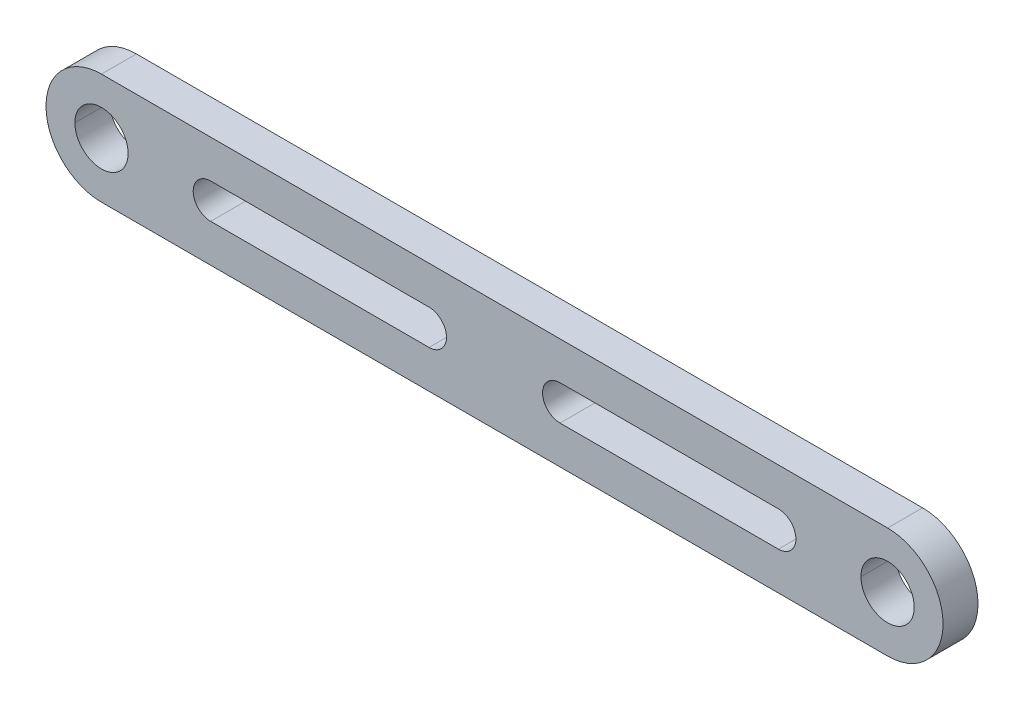
ISO-10303-21;
HEADER;
FILE_DESCRIPTION(('STEP AP214'),'2;1');
FILE_NAME('part.step','',(''),(''),'','','');
FILE_SCHEMA(('AUTOMOTIVE_DESIGN { 1 0 10303 214 1 1 1 1 }'));
ENDSEC;
DATA;
#1=APPLICATION_CONTEXT('core data for automotive mechanical design processes');
#2=APPLICATION_PROTOCOL_DEFINITION('international standard','automotive_design',2000,#1);
#3=PRODUCT_CONTEXT('',#1,'mechanical');
#4=PRODUCT('Part','Part','',(#3));
#5=PRODUCT_RELATED_PRODUCT_CATEGORY('part','',(#4));
#6=PRODUCT_DEFINITION_FORMATION('','',#4);
#7=PRODUCT_DEFINITION_CONTEXT('part definition',#1,'design');
#8=PRODUCT_DEFINITION('design','',#6,#7);
#9=PRODUCT_DEFINITION_SHAPE('','',#8);
#10=(LENGTH_UNIT() NAMED_UNIT(*) SI_UNIT(.MILLI.,.METRE.));
#11=(NAMED_UNIT(*) PLANE_ANGLE_UNIT() SI_UNIT($,.RADIAN.));
#12=(NAMED_UNIT(*) SI_UNIT($,.STERADIAN.) SOLID_ANGLE_UNIT());
#13=UNCERTAINTY_MEASURE_WITH_UNIT(LENGTH_MEASURE(1.E-05),#10,'distance_accuracy_value','');
#14=(GEOMETRIC_REPRESENTATION_CONTEXT(3) GLOBAL_UNCERTAINTY_ASSIGNED_CONTEXT((#13)) GLOBAL_UNIT_ASSIGNED_CONTEXT((#10,
#11,#12)) REPRESENTATION_CONTEXT('',''));
#15=CARTESIAN_POINT('',(0.,0.,0.));
#16=DIRECTION('',(0.,0.,1.));
#17=DIRECTION('',(1.,0.,0.));
#18=AXIS2_PLACEMENT_3D('',#15,#16,#17);
#19=CARTESIAN_POINT('',(-7.5,0.,-2.));
#20=DIRECTION('',(0.,0.,1.));
#21=DIRECTION('',(1.,0.,0.));
#22=AXIS2_PLACEMENT_3D('',#19,#20,#21);
#23=CYLINDRICAL_SURFACE('',#22,2.);
#24=CARTESIAN_POINT('',(-7.5,0.,-2.));
#25=DIRECTION('',(0.,0.,1.));
#26=DIRECTION('',(1.,0.,0.));
#27=AXIS2_PLACEMENT_3D('',#24,#25,#26);
#28=CIRCLE('',#27,2.);
#29=CARTESIAN_POINT('',(-5.5,0.,-2.));
#30=VERTEX_POINT('',#29);
#31=CARTESIAN_POINT('',(-7.5,2.,-2.));
#32=VERTEX_POINT('',#31);
#33=EDGE_CURVE('E42',#30,#32,#28,.T.);
#34=ORIENTED_EDGE('',*,*,#33,.F.);
#35=DIRECTION('',(0.,0.,1.));
#36=VECTOR('',#35,1.);
#37=CARTESIAN_POINT('',(-5.5,0.,-2.));
#38=LINE('',#37,#36);
#39=CARTESIAN_POINT('',(-5.5,0.,2.));
#40=VERTEX_POINT('',#39);
#41=EDGE_CURVE('E11',#30,#40,#38,.T.);
#42=ORIENTED_EDGE('',*,*,#41,.T.);
#43=CARTESIAN_POINT('',(-7.5,0.,2.));
#44=DIRECTION('',(0.,0.,1.));
#45=DIRECTION('',(1.,0.,0.));
#46=AXIS2_PLACEMENT_3D('',#43,#44,#45);
#47=CIRCLE('',#46,2.);
#48=CARTESIAN_POINT('',(-7.5,2.,2.));
#49=VERTEX_POINT('',#48);
#50=EDGE_CURVE('E28',#40,#49,#47,.T.);
#51=ORIENTED_EDGE('',*,*,#50,.T.);
#52=DIRECTION('',(0.,0.,1.));
#53=VECTOR('',#52,1.);
#54=CARTESIAN_POINT('',(-7.5,2.,-2.));
#55=LINE('',#54,#53);
#56=EDGE_CURVE('E286',#32,#49,#55,.T.);
#57=ORIENTED_EDGE('',*,*,#56,.F.);
#58=EDGE_LOOP('',(#34,#42,#51,#57));
#59=FACE_BOUND('',#58,.T.);
#60=ADVANCED_FACE('F17',(#59),#23,.F.);
#61=CARTESIAN_POINT('',(32.5,0.,-2.));
#62=DIRECTION('',(0.,0.,1.));
#63=DIRECTION('',(1.,0.,0.));
#64=AXIS2_PLACEMENT_3D('',#61,#62,#63);
#65=CYLINDRICAL_SURFACE('',#64,2.);
#66=CARTESIAN_POINT('',(32.5,0.,-2.));
#67=DIRECTION('',(0.,0.,1.));
#68=DIRECTION('',(1.,0.,0.));
#69=AXIS2_PLACEMENT_3D('',#66,#67,#68);
#70=CIRCLE('',#69,2.);
#71=CARTESIAN_POINT('',(34.5,0.,-2.));
#72=VERTEX_POINT('',#71);
#73=CARTESIAN_POINT('',(32.5,2.,-2.));
#74=VERTEX_POINT('',#73);
#75=EDGE_CURVE('E179',#72,#74,#70,.T.);
#76=ORIENTED_EDGE('',*,*,#75,.F.);
#77=DIRECTION('',(0.,0.,1.));
#78=VECTOR('',#77,1.);
#79=CARTESIAN_POINT('',(34.5,0.,-2.));
#80=LINE('',#79,#78);
#81=CARTESIAN_POINT('',(34.5,0.,2.));
#82=VERTEX_POINT('',#81);
#83=EDGE_CURVE('E265',#72,#82,#80,.T.);
#84=ORIENTED_EDGE('',*,*,#83,.T.);
#85=CARTESIAN_POINT('',(32.5,0.,2.));
#86=DIRECTION('',(0.,0.,1.));
#87=DIRECTION('',(1.,0.,0.));
#88=AXIS2_PLACEMENT_3D('',#85,#86,#87);
#89=CIRCLE('',#88,2.);
#90=CARTESIAN_POINT('',(32.5,2.,2.));
#91=VERTEX_POINT('',#90);
#92=EDGE_CURVE('E181',#82,#91,#89,.T.);
#93=ORIENTED_EDGE('',*,*,#92,.T.);
#94=DIRECTION('',(0.,0.,1.));
#95=VECTOR('',#94,1.);
#96=CARTESIAN_POINT('',(32.5,2.,-2.));
#97=LINE('',#96,#95);
#98=EDGE_CURVE('E165',#74,#91,#97,.T.);
#99=ORIENTED_EDGE('',*,*,#98,.F.);
#100=EDGE_LOOP('',(#76,#84,#93,#99));
#101=FACE_BOUND('',#100,.T.);
#102=ADVANCED_FACE('F177',(#101),#65,.F.);
#103=CARTESIAN_POINT('',(45.,0.,2.));
#104=DIRECTION('',(0.,0.,-1.));
#105=DIRECTION('',(-1.,0.,0.));
#106=AXIS2_PLACEMENT_3D('',#103,#104,#105);
#107=CYLINDRICAL_SURFACE('',#106,3.05);
#108=CARTESIAN_POINT('',(45.,0.,2.));
#109=DIRECTION('',(0.,0.,1.));
#110=DIRECTION('',(1.,0.,0.));
#111=AXIS2_PLACEMENT_3D('',#108,#109,#110);
#112=CIRCLE('',#111,3.05);
#113=CARTESIAN_POINT('',(41.95,0.,2.));
#114=VERTEX_POINT('',#113);
#115=CARTESIAN_POINT('',(48.05,0.,2.));
#116=VERTEX_POINT('',#115);
#117=EDGE_CURVE('E223',#114,#116,#112,.T.);
#118=ORIENTED_EDGE('',*,*,#117,.T.);
#119=DIRECTION('',(0.,0.,-1.));
#120=VECTOR('',#119,1.);
#121=CARTESIAN_POINT('',(48.05,0.,2.));
#122=LINE('',#121,#120);
#123=CARTESIAN_POINT('',(48.05,0.,-2.));
#124=VERTEX_POINT('',#123);
#125=EDGE_CURVE('E227',#116,#124,#122,.T.);
#126=ORIENTED_EDGE('',*,*,#125,.T.);
#127=CARTESIAN_POINT('',(45.,0.,-2.));
#128=DIRECTION('',(0.,0.,1.));
#129=DIRECTION('',(1.,0.,0.));
#130=AXIS2_PLACEMENT_3D('',#127,#128,#129);
#131=CIRCLE('',#130,3.05);
#132=CARTESIAN_POINT('',(41.95,0.,-2.));
#133=VERTEX_POINT('',#132);
#134=EDGE_CURVE('E255',#133,#124,#131,.T.);
#135=ORIENTED_EDGE('',*,*,#134,.F.);
#136=DIRECTION('',(0.,0.,-1.));
#137=VECTOR('',#136,1.);
#138=CARTESIAN_POINT('',(41.95,0.,2.));
#139=LINE('',#138,#137);
#140=EDGE_CURVE('E245',#114,#133,#139,.T.);
#141=ORIENTED_EDGE('',*,*,#140,.F.);
#142=EDGE_LOOP('',(#118,#126,#135,#141));
#143=FACE_BOUND('',#142,.T.);
#144=ADVANCED_FACE('F644',(#143),#107,.F.);
#145=CARTESIAN_POINT('',(-45.,0.,2.));
#146=DIRECTION('',(0.,0.,-1.));
#147=DIRECTION('',(-1.,0.,0.));
#148=AXIS2_PLACEMENT_3D('',#145,#146,#147);
#149=CYLINDRICAL_SURFACE('',#148,3.05);
#150=CARTESIAN_POINT('',(-45.,0.,2.));
#151=DIRECTION('',(0.,0.,1.));
#152=DIRECTION('',(1.,0.,0.));
#153=AXIS2_PLACEMENT_3D('',#150,#151,#152);
#154=CIRCLE('',#153,3.05);
#155=CARTESIAN_POINT('',(-48.05,0.,2.));
#156=VERTEX_POINT('',#155);
#157=CARTESIAN_POINT('',(-41.95,0.,2.));
#158=VERTEX_POINT('',#157);
#159=EDGE_CURVE('E348',#156,#158,#154,.T.);
#160=ORIENTED_EDGE('',*,*,#159,.T.);
#161=DIRECTION('',(0.,0.,-1.));
#162=VECTOR('',#161,1.);
#163=CARTESIAN_POINT('',(-41.95,0.,2.));
#164=LINE('',#163,#162);
#165=CARTESIAN_POINT('',(-41.95,0.,-2.));
#166=VERTEX_POINT('',#165);
#167=EDGE_CURVE('E232',#158,#166,#164,.T.);
#168=ORIENTED_EDGE('',*,*,#167,.T.);
#169=CARTESIAN_POINT('',(-45.,0.,-2.));
#170=DIRECTION('',(0.,0.,1.));
#171=DIRECTION('',(1.,0.,0.));
#172=AXIS2_PLACEMENT_3D('',#169,#170,#171);
#173=CIRCLE('',#172,3.05);
#174=CARTESIAN_POINT('',(-48.05,0.,-2.));
#175=VERTEX_POINT('',#174);
#176=EDGE_CURVE('E196',#175,#166,#173,.T.);
#177=ORIENTED_EDGE('',*,*,#176,.F.);
#178=DIRECTION('',(0.,0.,-1.));
#179=VECTOR('',#178,1.);
#180=CARTESIAN_POINT('',(-48.05,0.,2.));
#181=LINE('',#180,#179);
#182=EDGE_CURVE('E244',#156,#175,#181,.T.);
#183=ORIENTED_EDGE('',*,*,#182,.F.);
#184=EDGE_LOOP('',(#160,#168,#177,#183));
#185=FACE_BOUND('',#184,.T.);
#186=ADVANCED_FACE('F586',(#185),#149,.F.);
#187=CARTESIAN_POINT('',(-45.,0.,2.));
#188=DIRECTION('',(0.,0.,-1.));
#189=DIRECTION('',(-1.,0.,0.));
#190=AXIS2_PLACEMENT_3D('',#187,#188,#189);
#191=CYLINDRICAL_SURFACE('',#190,6.35);
#192=CARTESIAN_POINT('',(-45.,0.,2.));
#193=DIRECTION('',(0.,0.,1.));
#194=DIRECTION('',(1.,0.,0.));
#195=AXIS2_PLACEMENT_3D('',#192,#193,#194);
#196=CIRCLE('',#195,6.35);
#197=CARTESIAN_POINT('',(-51.35,0.,2.));
#198=VERTEX_POINT('',#197);
#199=CARTESIAN_POINT('',(-45.,-6.35,2.));
#200=VERTEX_POINT('',#199);
#201=EDGE_CURVE('E309',#198,#200,#196,.T.);
#202=ORIENTED_EDGE('',*,*,#201,.F.);
#203=DIRECTION('',(0.,0.,-1.));
#204=VECTOR('',#203,1.);
#205=CARTESIAN_POINT('',(-51.35,0.,2.));
#206=LINE('',#205,#204);
#207=CARTESIAN_POINT('',(-51.35,0.,-2.));
#208=VERTEX_POINT('',#207);
#209=EDGE_CURVE('E228',#198,#208,#206,.T.);
#210=ORIENTED_EDGE('',*,*,#209,.T.);
#211=CARTESIAN_POINT('',(-45.,0.,-2.));
#212=DIRECTION('',(0.,0.,1.));
#213=DIRECTION('',(1.,0.,0.));
#214=AXIS2_PLACEMENT_3D('',#211,#212,#213);
#215=CIRCLE('',#214,6.35);
#216=CARTESIAN_POINT('',(-45.,-6.35,-2.));
#217=VERTEX_POINT('',#216);
#218=EDGE_CURVE('E233',#208,#217,#215,.T.);
#219=ORIENTED_EDGE('',*,*,#218,.T.);
#220=DIRECTION('',(0.,0.,-1.));
#221=VECTOR('',#220,1.);
#222=CARTESIAN_POINT('',(-45.,-6.35,2.));
#223=LINE('',#222,#221);
#224=EDGE_CURVE('E297',#200,#217,#223,.T.);
#225=ORIENTED_EDGE('',*,*,#224,.F.);
#226=EDGE_LOOP('',(#202,#210,#219,#225));
#227=FACE_BOUND('',#226,.T.);
#228=ADVANCED_FACE('F546',(#227),#191,.T.);
#229=CARTESIAN_POINT('',(-45.,0.,2.));
#230=DIRECTION('',(0.,0.,1.));
#231=DIRECTION('',(1.,0.,0.));
#232=AXIS2_PLACEMENT_3D('',#229,#230,#231);
#233=PLANE('',#232);
#234=CARTESIAN_POINT('',(-45.,0.,2.));
#235=DIRECTION('',(0.,0.,1.));
#236=DIRECTION('',(1.,0.,0.));
#237=AXIS2_PLACEMENT_3D('',#234,#235,#236);
#238=CIRCLE('',#237,6.35);
#239=CARTESIAN_POINT('',(-45.,6.35,2.));
#240=VERTEX_POINT('',#239);
#241=EDGE_CURVE('E307',#240,#198,#238,.T.);
#242=ORIENTED_EDGE('',*,*,#241,.T.);
#243=ORIENTED_EDGE('',*,*,#201,.T.);
#244=DIRECTION('',(1.,0.,0.));
#245=VECTOR('',#244,1.);
#246=CARTESIAN_POINT('',(-45.,-6.35,2.));
#247=LINE('',#246,#245);
#248=CARTESIAN_POINT('',(45.,-6.35,2.));
#249=VERTEX_POINT('',#248);
#250=EDGE_CURVE('E381',#200,#249,#247,.T.);
#251=ORIENTED_EDGE('',*,*,#250,.T.);
#252=CARTESIAN_POINT('',(45.,0.,2.));
#253=DIRECTION('',(0.,0.,1.));
#254=DIRECTION('',(1.,0.,0.));
#255=AXIS2_PLACEMENT_3D('',#252,#253,#254);
#256=CIRCLE('',#255,6.35);
#257=CARTESIAN_POINT('',(45.,6.35,2.));
#258=VERTEX_POINT('',#257);
#259=EDGE_CURVE('E283',#249,#258,#256,.T.);
#260=ORIENTED_EDGE('',*,*,#259,.T.);
#261=DIRECTION('',(-1.,0.,0.));
#262=VECTOR('',#261,1.);
#263=CARTESIAN_POINT('',(-45.,6.35,2.));
#264=LINE('',#263,#262);
#265=EDGE_CURVE('E280',#258,#240,#264,.T.);
#266=ORIENTED_EDGE('',*,*,#265,.T.);
#267=EDGE_LOOP('',(#242,#243,#251,#260,#266));
#268=FACE_BOUND('',#267,.T.);
#269=CARTESIAN_POINT('',(-32.5,0.,2.));
#270=DIRECTION('',(0.,0.,1.));
#271=DIRECTION('',(1.,0.,0.));
#272=AXIS2_PLACEMENT_3D('',#269,#270,#271);
#273=CIRCLE('',#272,2.);
#274=CARTESIAN_POINT('',(-32.5,2.,2.));
#275=VERTEX_POINT('',#274);
#276=CARTESIAN_POINT('',(-32.5,-2.,2.));
#277=VERTEX_POINT('',#276);
#278=EDGE_CURVE('E262',#275,#277,#273,.T.);
#279=ORIENTED_EDGE('',*,*,#278,.F.);
#280=DIRECTION('',(-1.,0.,0.));
#281=VECTOR('',#280,1.);
#282=CARTESIAN_POINT('',(-32.5,2.,2.));
#283=LINE('',#282,#281);
#284=EDGE_CURVE('E238',#49,#275,#283,.T.);
#285=ORIENTED_EDGE('',*,*,#284,.F.);
#286=ORIENTED_EDGE('',*,*,#50,.F.);
#287=CARTESIAN_POINT('',(-7.5,0.,2.));
#288=DIRECTION('',(0.,0.,1.));
#289=DIRECTION('',(1.,0.,0.));
#290=AXIS2_PLACEMENT_3D('',#287,#288,#289);
#291=CIRCLE('',#290,2.);
#292=CARTESIAN_POINT('',(-7.5,-2.,2.));
#293=VERTEX_POINT('',#292);
#294=EDGE_CURVE('E239',#293,#40,#291,.T.);
#295=ORIENTED_EDGE('',*,*,#294,.F.);
#296=DIRECTION('',(1.,0.,0.));
#297=VECTOR('',#296,1.);
#298=CARTESIAN_POINT('',(-32.5,-2.,2.));
#299=LINE('',#298,#297);
#300=EDGE_CURVE('E125',#277,#293,#299,.T.);
#301=ORIENTED_EDGE('',*,*,#300,.F.);
#302=EDGE_LOOP('',(#279,#285,#286,#295,#301));
#303=FACE_BOUND('',#302,.T.);
#304=CARTESIAN_POINT('',(7.5,0.,2.));
#305=DIRECTION('',(0.,0.,1.));
#306=DIRECTION('',(1.,0.,0.));
#307=AXIS2_PLACEMENT_3D('',#304,#305,#306);
#308=CIRCLE('',#307,2.);
#309=CARTESIAN_POINT('',(7.5,2.,2.));
#310=VERTEX_POINT('',#309);
#311=CARTESIAN_POINT('',(7.5,-2.,2.));
#312=VERTEX_POINT('',#311);
#313=EDGE_CURVE('E183',#310,#312,#308,.T.);
#314=ORIENTED_EDGE('',*,*,#313,.F.);
#315=DIRECTION('',(-1.,0.,0.));
#316=VECTOR('',#315,1.);
#317=CARTESIAN_POINT('',(7.5,2.,2.));
#318=LINE('',#317,#316);
#319=EDGE_CURVE('E111',#91,#310,#318,.T.);
#320=ORIENTED_EDGE('',*,*,#319,.F.);
#321=ORIENTED_EDGE('',*,*,#92,.F.);
#322=CARTESIAN_POINT('',(32.5,0.,2.));
#323=DIRECTION('',(0.,0.,1.));
#324=DIRECTION('',(1.,0.,0.));
#325=AXIS2_PLACEMENT_3D('',#322,#323,#324);
#326=CIRCLE('',#325,2.);
#327=CARTESIAN_POINT('',(32.5,-2.,2.));
#328=VERTEX_POINT('',#327);
#329=EDGE_CURVE('E315',#328,#82,#326,.T.);
#330=ORIENTED_EDGE('',*,*,#329,.F.);
#331=DIRECTION('',(1.,0.,0.));
#332=VECTOR('',#331,1.);
#333=CARTESIAN_POINT('',(7.5,-2.,2.));
#334=LINE('',#333,#332);
#335=EDGE_CURVE('E261',#312,#328,#334,.T.);
#336=ORIENTED_EDGE('',*,*,#335,.F.);
#337=EDGE_LOOP('',(#314,#320,#321,#330,#336));
#338=FACE_BOUND('',#337,.T.);
#339=ORIENTED_EDGE('',*,*,#159,.F.);
#340=CARTESIAN_POINT('',(-45.,0.,2.));
#341=DIRECTION('',(0.,0.,1.));
#342=DIRECTION('',(1.,0.,0.));
#343=AXIS2_PLACEMENT_3D('',#340,#341,#342);
#344=CIRCLE('',#343,3.05);
#345=EDGE_CURVE('E273',#158,#156,#344,.T.);
#346=ORIENTED_EDGE('',*,*,#345,.F.);
#347=EDGE_LOOP('',(#339,#346));
#348=FACE_BOUND('',#347,.T.);
#349=ORIENTED_EDGE('',*,*,#117,.F.);
#350=CARTESIAN_POINT('',(45.,0.,2.));
#351=DIRECTION('',(0.,0.,1.));
#352=DIRECTION('',(1.,0.,0.));
#353=AXIS2_PLACEMENT_3D('',#350,#351,#352);
#354=CIRCLE('',#353,3.05);
#355=EDGE_CURVE('E240',#116,#114,#354,.T.);
#356=ORIENTED_EDGE('',*,*,#355,.F.);
#357=EDGE_LOOP('',(#349,#356));
#358=FACE_BOUND('',#357,.T.);
#359=ADVANCED_FACE('F336',(#268,#303,#338,#348,#358),#233,.T.);
#360=CARTESIAN_POINT('',(-45.,0.,-2.));
#361=DIRECTION('',(0.,0.,1.));
#362=DIRECTION('',(1.,0.,0.));
#363=AXIS2_PLACEMENT_3D('',#360,#361,#362);
#364=PLANE('',#363);
#365=CARTESIAN_POINT('',(-45.,0.,-2.));
#366=DIRECTION('',(0.,0.,1.));
#367=DIRECTION('',(1.,0.,0.));
#368=AXIS2_PLACEMENT_3D('',#365,#366,#367);
#369=CIRCLE('',#368,6.35);
#370=CARTESIAN_POINT('',(-45.,6.35,-2.));
#371=VERTEX_POINT('',#370);
#372=EDGE_CURVE('E287',#371,#208,#369,.T.);
#373=ORIENTED_EDGE('',*,*,#372,.F.);
#374=DIRECTION('',(-1.,0.,0.));
#375=VECTOR('',#374,1.);
#376=CARTESIAN_POINT('',(-45.,6.35,-2.));
#377=LINE('',#376,#375);
#378=CARTESIAN_POINT('',(45.,6.35,-2.));
#379=VERTEX_POINT('',#378);
#380=EDGE_CURVE('E251',#379,#371,#377,.T.);
#381=ORIENTED_EDGE('',*,*,#380,.F.);
#382=CARTESIAN_POINT('',(45.,0.,-2.));
#383=DIRECTION('',(0.,0.,1.));
#384=DIRECTION('',(1.,0.,0.));
#385=AXIS2_PLACEMENT_3D('',#382,#383,#384);
#386=CIRCLE('',#385,6.35);
#387=CARTESIAN_POINT('',(45.,-6.35,-2.));
#388=VERTEX_POINT('',#387);
#389=EDGE_CURVE('E250',#388,#379,#386,.T.);
#390=ORIENTED_EDGE('',*,*,#389,.F.);
#391=DIRECTION('',(1.,0.,0.));
#392=VECTOR('',#391,1.);
#393=CARTESIAN_POINT('',(-45.,-6.35,-2.));
#394=LINE('',#393,#392);
#395=EDGE_CURVE('E21',#217,#388,#394,.T.);
#396=ORIENTED_EDGE('',*,*,#395,.F.);
#397=ORIENTED_EDGE('',*,*,#218,.F.);
#398=EDGE_LOOP('',(#373,#381,#390,#396,#397));
#399=FACE_BOUND('',#398,.T.);
#400=DIRECTION('',(-1.,0.,0.));
#401=VECTOR('',#400,1.);
#402=CARTESIAN_POINT('',(-32.5,2.,-2.));
#403=LINE('',#402,#401);
#404=CARTESIAN_POINT('',(-32.5,2.,-2.));
#405=VERTEX_POINT('',#404);
#406=EDGE_CURVE('E221',#32,#405,#403,.T.);
#407=ORIENTED_EDGE('',*,*,#406,.T.);
#408=CARTESIAN_POINT('',(-32.5,0.,-2.));
#409=DIRECTION('',(0.,0.,1.));
#410=DIRECTION('',(1.,0.,0.));
#411=AXIS2_PLACEMENT_3D('',#408,#409,#410);
#412=CIRCLE('',#411,2.);
#413=CARTESIAN_POINT('',(-32.5,-2.,-2.));
#414=VERTEX_POINT('',#413);
#415=EDGE_CURVE('E217',#405,#414,#412,.T.);
#416=ORIENTED_EDGE('',*,*,#415,.T.);
#417=DIRECTION('',(1.,0.,0.));
#418=VECTOR('',#417,1.);
#419=CARTESIAN_POINT('',(-32.5,-2.,-2.));
#420=LINE('',#419,#418);
#421=CARTESIAN_POINT('',(-7.5,-2.,-2.));
#422=VERTEX_POINT('',#421);
#423=EDGE_CURVE('E222',#414,#422,#420,.T.);
#424=ORIENTED_EDGE('',*,*,#423,.T.);
#425=CARTESIAN_POINT('',(-7.5,0.,-2.));
#426=DIRECTION('',(0.,0.,1.));
#427=DIRECTION('',(1.,0.,0.));
#428=AXIS2_PLACEMENT_3D('',#425,#426,#427);
#429=CIRCLE('',#428,2.);
#430=EDGE_CURVE('E209',#422,#30,#429,.T.);
#431=ORIENTED_EDGE('',*,*,#430,.T.);
#432=ORIENTED_EDGE('',*,*,#33,.T.);
#433=EDGE_LOOP('',(#407,#416,#424,#431,#432));
#434=FACE_BOUND('',#433,.T.);
#435=DIRECTION('',(-1.,0.,0.));
#436=VECTOR('',#435,1.);
#437=CARTESIAN_POINT('',(7.5,2.,-2.));
#438=LINE('',#437,#436);
#439=CARTESIAN_POINT('',(7.5,2.,-2.));
#440=VERTEX_POINT('',#439);
#441=EDGE_CURVE('E191',#74,#440,#438,.T.);
#442=ORIENTED_EDGE('',*,*,#441,.T.);
#443=CARTESIAN_POINT('',(7.5,0.,-2.));
#444=DIRECTION('',(0.,0.,1.));
#445=DIRECTION('',(1.,0.,0.));
#446=AXIS2_PLACEMENT_3D('',#443,#444,#445);
#447=CIRCLE('',#446,2.);
#448=CARTESIAN_POINT('',(7.5,-2.,-2.));
#449=VERTEX_POINT('',#448);
#450=EDGE_CURVE('E202',#440,#449,#447,.T.);
#451=ORIENTED_EDGE('',*,*,#450,.T.);
#452=DIRECTION('',(1.,0.,0.));
#453=VECTOR('',#452,1.);
#454=CARTESIAN_POINT('',(7.5,-2.,-2.));
#455=LINE('',#454,#453);
#456=CARTESIAN_POINT('',(32.5,-2.,-2.));
#457=VERTEX_POINT('',#456);
#458=EDGE_CURVE('E212',#449,#457,#455,.T.);
#459=ORIENTED_EDGE('',*,*,#458,.T.);
#460=CARTESIAN_POINT('',(32.5,0.,-2.));
#461=DIRECTION('',(0.,0.,1.));
#462=DIRECTION('',(1.,0.,0.));
#463=AXIS2_PLACEMENT_3D('',#460,#461,#462);
#464=CIRCLE('',#463,2.);
#465=EDGE_CURVE('E194',#457,#72,#464,.T.);
#466=ORIENTED_EDGE('',*,*,#465,.T.);
#467=ORIENTED_EDGE('',*,*,#75,.T.);
#468=EDGE_LOOP('',(#442,#451,#459,#466,#467));
#469=FACE_BOUND('',#468,.T.);
#470=ORIENTED_EDGE('',*,*,#176,.T.);
#471=CARTESIAN_POINT('',(-45.,0.,-2.));
#472=DIRECTION('',(0.,0.,1.));
#473=DIRECTION('',(1.,0.,0.));
#474=AXIS2_PLACEMENT_3D('',#471,#472,#473);
#475=CIRCLE('',#474,3.05);
#476=EDGE_CURVE('E303',#166,#175,#475,.T.);
#477=ORIENTED_EDGE('',*,*,#476,.T.);
#478=EDGE_LOOP('',(#470,#477));
#479=FACE_BOUND('',#478,.T.);
#480=ORIENTED_EDGE('',*,*,#134,.T.);
#481=CARTESIAN_POINT('',(45.,0.,-2.));
#482=DIRECTION('',(0.,0.,1.));
#483=DIRECTION('',(1.,0.,0.));
#484=AXIS2_PLACEMENT_3D('',#481,#482,#483);
#485=CIRCLE('',#484,3.05);
#486=EDGE_CURVE('E252',#124,#133,#485,.T.);
#487=ORIENTED_EDGE('',*,*,#486,.T.);
#488=EDGE_LOOP('',(#480,#487));
#489=FACE_BOUND('',#488,.T.);
#490=ADVANCED_FACE('F188',(#399,#434,#469,#479,#489),#364,.F.);
#491=CARTESIAN_POINT('',(-45.,0.,2.));
#492=DIRECTION('',(0.,0.,-1.));
#493=DIRECTION('',(-1.,0.,0.));
#494=AXIS2_PLACEMENT_3D('',#491,#492,#493);
#495=CYLINDRICAL_SURFACE('',#494,6.35);
#496=ORIENTED_EDGE('',*,*,#209,.F.);
#497=ORIENTED_EDGE('',*,*,#241,.F.);
#498=DIRECTION('',(0.,0.,-1.));
#499=VECTOR('',#498,1.);
#500=CARTESIAN_POINT('',(-45.,6.35,2.));
#501=LINE('',#500,#499);
#502=EDGE_CURVE('E256',#240,#371,#501,.T.);
#503=ORIENTED_EDGE('',*,*,#502,.T.);
#504=ORIENTED_EDGE('',*,*,#372,.T.);
#505=EDGE_LOOP('',(#496,#497,#503,#504));
#506=FACE_BOUND('',#505,.T.);
#507=ADVANCED_FACE('F19',(#506),#495,.T.);
#508=CARTESIAN_POINT('',(-45.,-6.35,2.));
#509=DIRECTION('',(0.,1.,0.));
#510=DIRECTION('',(1.,0.,0.));
#511=AXIS2_PLACEMENT_3D('',#508,#509,#510);
#512=PLANE('',#511);
#513=ORIENTED_EDGE('',*,*,#395,.T.);
#514=DIRECTION('',(0.,0.,-1.));
#515=VECTOR('',#514,1.);
#516=CARTESIAN_POINT('',(45.,-6.35,2.));
#517=LINE('',#516,#515);
#518=EDGE_CURVE('E246',#249,#388,#517,.T.);
#519=ORIENTED_EDGE('',*,*,#518,.F.);
#520=ORIENTED_EDGE('',*,*,#250,.F.);
#521=ORIENTED_EDGE('',*,*,#224,.T.);
#522=EDGE_LOOP('',(#513,#519,#520,#521));
#523=FACE_BOUND('',#522,.T.);
#524=ADVANCED_FACE('F454',(#523),#512,.F.);
#525=CARTESIAN_POINT('',(45.,0.,2.));
#526=DIRECTION('',(0.,0.,-1.));
#527=DIRECTION('',(-1.,0.,0.));
#528=AXIS2_PLACEMENT_3D('',#525,#526,#527);
#529=CYLINDRICAL_SURFACE('',#528,6.35);
#530=ORIENTED_EDGE('',*,*,#389,.T.);
#531=DIRECTION('',(0.,0.,-1.));
#532=VECTOR('',#531,1.);
#533=CARTESIAN_POINT('',(45.,6.35,2.));
#534=LINE('',#533,#532);
#535=EDGE_CURVE('E355',#258,#379,#534,.T.);
#536=ORIENTED_EDGE('',*,*,#535,.F.);
#537=ORIENTED_EDGE('',*,*,#259,.F.);
#538=ORIENTED_EDGE('',*,*,#518,.T.);
#539=EDGE_LOOP('',(#530,#536,#537,#538));
#540=FACE_BOUND('',#539,.T.);
#541=ADVANCED_FACE('F447',(#540),#529,.T.);
#542=CARTESIAN_POINT('',(-45.,6.35,2.));
#543=DIRECTION('',(0.,-1.,0.));
#544=DIRECTION('',(0.,0.,-1.));
#545=AXIS2_PLACEMENT_3D('',#542,#543,#544);
#546=PLANE('',#545);
#547=ORIENTED_EDGE('',*,*,#380,.T.);
#548=ORIENTED_EDGE('',*,*,#502,.F.);
#549=ORIENTED_EDGE('',*,*,#265,.F.);
#550=ORIENTED_EDGE('',*,*,#535,.T.);
#551=EDGE_LOOP('',(#547,#548,#549,#550));
#552=FACE_BOUND('',#551,.T.);
#553=ADVANCED_FACE('F449',(#552),#546,.F.);
#554=CARTESIAN_POINT('',(-45.,0.,2.));
#555=DIRECTION('',(0.,0.,-1.));
#556=DIRECTION('',(-1.,0.,0.));
#557=AXIS2_PLACEMENT_3D('',#554,#555,#556);
#558=CYLINDRICAL_SURFACE('',#557,3.05);
#559=ORIENTED_EDGE('',*,*,#167,.F.);
#560=ORIENTED_EDGE('',*,*,#345,.T.);
#561=ORIENTED_EDGE('',*,*,#182,.T.);
#562=ORIENTED_EDGE('',*,*,#476,.F.);
#563=EDGE_LOOP('',(#559,#560,#561,#562));
#564=FACE_BOUND('',#563,.T.);
#565=ADVANCED_FACE('F558',(#564),#558,.F.);
#566=CARTESIAN_POINT('',(45.,0.,2.));
#567=DIRECTION('',(0.,0.,-1.));
#568=DIRECTION('',(-1.,0.,0.));
#569=AXIS2_PLACEMENT_3D('',#566,#567,#568);
#570=CYLINDRICAL_SURFACE('',#569,3.05);
#571=ORIENTED_EDGE('',*,*,#125,.F.);
#572=ORIENTED_EDGE('',*,*,#355,.T.);
#573=ORIENTED_EDGE('',*,*,#140,.T.);
#574=ORIENTED_EDGE('',*,*,#486,.F.);
#575=EDGE_LOOP('',(#571,#572,#573,#574));
#576=FACE_BOUND('',#575,.T.);
#577=ADVANCED_FACE('F562',(#576),#570,.F.);
#578=CARTESIAN_POINT('',(7.5,0.,-2.));
#579=DIRECTION('',(0.,0.,1.));
#580=DIRECTION('',(1.,0.,0.));
#581=AXIS2_PLACEMENT_3D('',#578,#579,#580);
#582=CYLINDRICAL_SURFACE('',#581,2.);
#583=DIRECTION('',(0.,0.,1.));
#584=VECTOR('',#583,1.);
#585=CARTESIAN_POINT('',(7.5,-2.,-2.));
#586=LINE('',#585,#584);
#587=EDGE_CURVE('E371',#449,#312,#586,.T.);
#588=ORIENTED_EDGE('',*,*,#587,.F.);
#589=ORIENTED_EDGE('',*,*,#450,.F.);
#590=DIRECTION('',(0.,0.,1.));
#591=VECTOR('',#590,1.);
#592=CARTESIAN_POINT('',(7.5,2.,-2.));
#593=LINE('',#592,#591);
#594=EDGE_CURVE('E200',#440,#310,#593,.T.);
#595=ORIENTED_EDGE('',*,*,#594,.T.);
#596=ORIENTED_EDGE('',*,*,#313,.T.);
#597=EDGE_LOOP('',(#588,#589,#595,#596));
#598=FACE_BOUND('',#597,.T.);
#599=ADVANCED_FACE('F409',(#598),#582,.F.);
#600=CARTESIAN_POINT('',(7.5,2.,-2.));
#601=DIRECTION('',(0.,1.,0.));
#602=DIRECTION('',(1.,0.,0.));
#603=AXIS2_PLACEMENT_3D('',#600,#601,#602);
#604=PLANE('',#603);
#605=ORIENTED_EDGE('',*,*,#594,.F.);
#606=ORIENTED_EDGE('',*,*,#441,.F.);
#607=ORIENTED_EDGE('',*,*,#98,.T.);
#608=ORIENTED_EDGE('',*,*,#319,.T.);
#609=EDGE_LOOP('',(#605,#606,#607,#608));
#610=FACE_BOUND('',#609,.T.);
#611=ADVANCED_FACE('F198',(#610),#604,.F.);
#612=CARTESIAN_POINT('',(32.5,0.,-2.));
#613=DIRECTION('',(0.,0.,1.));
#614=DIRECTION('',(1.,0.,0.));
#615=AXIS2_PLACEMENT_3D('',#612,#613,#614);
#616=CYLINDRICAL_SURFACE('',#615,2.);
#617=ORIENTED_EDGE('',*,*,#83,.F.);
#618=ORIENTED_EDGE('',*,*,#465,.F.);
#619=DIRECTION('',(0.,0.,1.));
#620=VECTOR('',#619,1.);
#621=CARTESIAN_POINT('',(32.5,-2.,-2.));
#622=LINE('',#621,#620);
#623=EDGE_CURVE('E311',#457,#328,#622,.T.);
#624=ORIENTED_EDGE('',*,*,#623,.T.);
#625=ORIENTED_EDGE('',*,*,#329,.T.);
#626=EDGE_LOOP('',(#617,#618,#624,#625));
#627=FACE_BOUND('',#626,.T.);
#628=ADVANCED_FACE('F418',(#627),#616,.F.);
#629=CARTESIAN_POINT('',(7.5,-2.,-2.));
#630=DIRECTION('',(0.,-1.,0.));
#631=DIRECTION('',(0.,0.,-1.));
#632=AXIS2_PLACEMENT_3D('',#629,#630,#631);
#633=PLANE('',#632);
#634=ORIENTED_EDGE('',*,*,#623,.F.);
#635=ORIENTED_EDGE('',*,*,#458,.F.);
#636=ORIENTED_EDGE('',*,*,#587,.T.);
#637=ORIENTED_EDGE('',*,*,#335,.T.);
#638=EDGE_LOOP('',(#634,#635,#636,#637));
#639=FACE_BOUND('',#638,.T.);
#640=ADVANCED_FACE('F414',(#639),#633,.F.);
#641=CARTESIAN_POINT('',(-32.5,0.,-2.));
#642=DIRECTION('',(0.,0.,1.));
#643=DIRECTION('',(1.,0.,0.));
#644=AXIS2_PLACEMENT_3D('',#641,#642,#643);
#645=CYLINDRICAL_SURFACE('',#644,2.);
#646=DIRECTION('',(0.,0.,1.));
#647=VECTOR('',#646,1.);
#648=CARTESIAN_POINT('',(-32.5,-2.,-2.));
#649=LINE('',#648,#647);
#650=EDGE_CURVE('E268',#414,#277,#649,.T.);
#651=ORIENTED_EDGE('',*,*,#650,.F.);
#652=ORIENTED_EDGE('',*,*,#415,.F.);
#653=DIRECTION('',(0.,0.,1.));
#654=VECTOR('',#653,1.);
#655=CARTESIAN_POINT('',(-32.5,2.,-2.));
#656=LINE('',#655,#654);
#657=EDGE_CURVE('E258',#405,#275,#656,.T.);
#658=ORIENTED_EDGE('',*,*,#657,.T.);
#659=ORIENTED_EDGE('',*,*,#278,.T.);
#660=EDGE_LOOP('',(#651,#652,#658,#659));
#661=FACE_BOUND('',#660,.T.);
#662=ADVANCED_FACE('F610',(#661),#645,.F.);
#663=CARTESIAN_POINT('',(-32.5,2.,-2.));
#664=DIRECTION('',(0.,1.,0.));
#665=DIRECTION('',(1.,0.,0.));
#666=AXIS2_PLACEMENT_3D('',#663,#664,#665);
#667=PLANE('',#666);
#668=ORIENTED_EDGE('',*,*,#657,.F.);
#669=ORIENTED_EDGE('',*,*,#406,.F.);
#670=ORIENTED_EDGE('',*,*,#56,.T.);
#671=ORIENTED_EDGE('',*,*,#284,.T.);
#672=EDGE_LOOP('',(#668,#669,#670,#671));
#673=FACE_BOUND('',#672,.T.);
#674=ADVANCED_FACE('F340',(#673),#667,.F.);
#675=CARTESIAN_POINT('',(-7.5,0.,-2.));
#676=DIRECTION('',(0.,0.,1.));
#677=DIRECTION('',(1.,0.,0.));
#678=AXIS2_PLACEMENT_3D('',#675,#676,#677);
#679=CYLINDRICAL_SURFACE('',#678,2.);
#680=ORIENTED_EDGE('',*,*,#41,.F.);
#681=ORIENTED_EDGE('',*,*,#430,.F.);
#682=DIRECTION('',(0.,0.,1.));
#683=VECTOR('',#682,1.);
#684=CARTESIAN_POINT('',(-7.5,-2.,-2.));
#685=LINE('',#684,#683);
#686=EDGE_CURVE('E234',#422,#293,#685,.T.);
#687=ORIENTED_EDGE('',*,*,#686,.T.);
#688=ORIENTED_EDGE('',*,*,#294,.T.);
#689=EDGE_LOOP('',(#680,#681,#687,#688));
#690=FACE_BOUND('',#689,.T.);
#691=ADVANCED_FACE('F331',(#690),#679,.F.);
#692=CARTESIAN_POINT('',(-32.5,-2.,-2.));
#693=DIRECTION('',(0.,-1.,0.));
#694=DIRECTION('',(0.,0.,-1.));
#695=AXIS2_PLACEMENT_3D('',#692,#693,#694);
#696=PLANE('',#695);
#697=ORIENTED_EDGE('',*,*,#686,.F.);
#698=ORIENTED_EDGE('',*,*,#423,.F.);
#699=ORIENTED_EDGE('',*,*,#650,.T.);
#700=ORIENTED_EDGE('',*,*,#300,.T.);
#701=EDGE_LOOP('',(#697,#698,#699,#700));
#702=FACE_BOUND('',#701,.T.);
#703=ADVANCED_FACE('F578',(#702),#696,.F.);
#704=CLOSED_SHELL('',(#60,#102,#144,#186,#228,#359,#490,#507,#524,#541,#553,#565,#577,#599,#611,
#628,#640,#662,#674,#691,#703));
#705=MANIFOLD_SOLID_BREP('B1',#704);
#706=ADVANCED_BREP_SHAPE_REPRESENTATION('',(#18,#705),#14);
#707=SHAPE_DEFINITION_REPRESENTATION(#9,#706);
ENDSEC;
END-ISO-10303-21;
